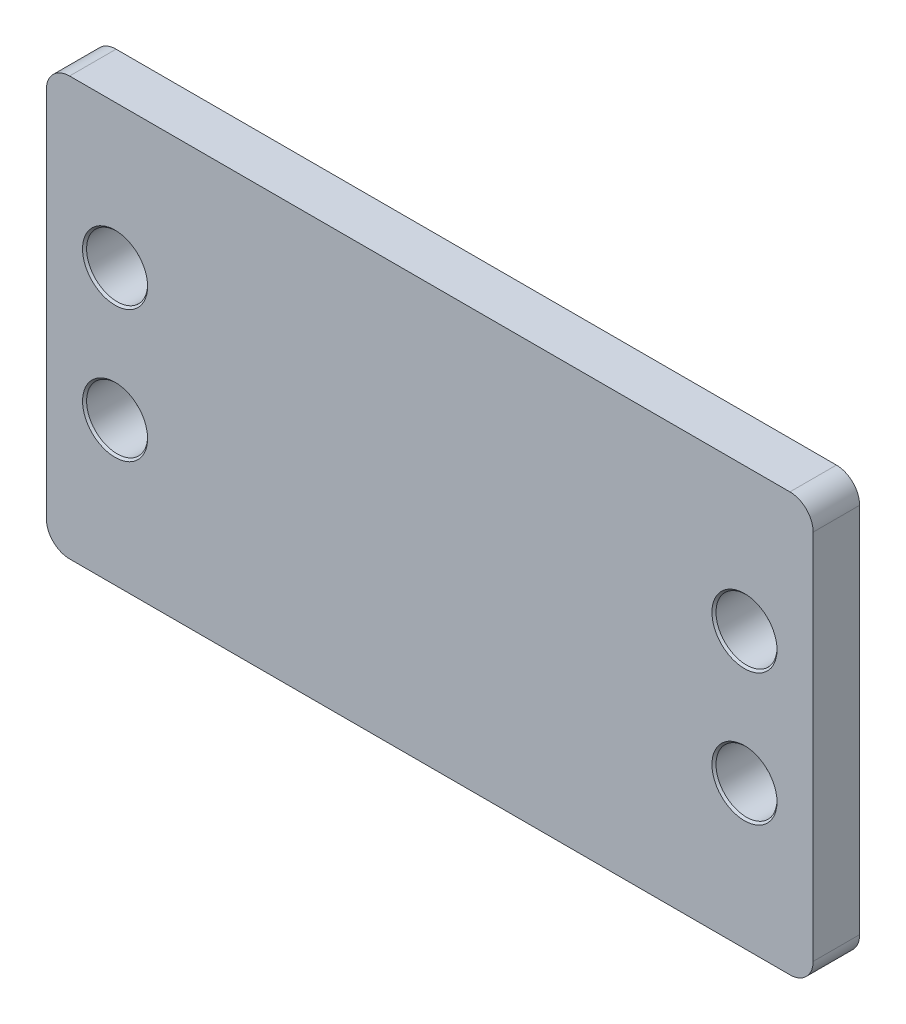
ISO-10303-21;
HEADER;
FILE_DESCRIPTION(('STEP AP214'),'2;1');
FILE_NAME('part.step','',(''),(''),'','','');
FILE_SCHEMA(('AUTOMOTIVE_DESIGN { 1 0 10303 214 1 1 1 1 }'));
ENDSEC;
DATA;
#1=APPLICATION_CONTEXT('core data for automotive mechanical design processes');
#2=APPLICATION_PROTOCOL_DEFINITION('international standard','automotive_design',2000,#1);
#3=PRODUCT_CONTEXT('',#1,'mechanical');
#4=PRODUCT('Part','Part','',(#3));
#5=PRODUCT_RELATED_PRODUCT_CATEGORY('part','',(#4));
#6=PRODUCT_DEFINITION_FORMATION('','',#4);
#7=PRODUCT_DEFINITION_CONTEXT('part definition',#1,'design');
#8=PRODUCT_DEFINITION('design','',#6,#7);
#9=PRODUCT_DEFINITION_SHAPE('','',#8);
#10=(LENGTH_UNIT() NAMED_UNIT(*) SI_UNIT(.MILLI.,.METRE.));
#11=(NAMED_UNIT(*) PLANE_ANGLE_UNIT() SI_UNIT($,.RADIAN.));
#12=(NAMED_UNIT(*) SI_UNIT($,.STERADIAN.) SOLID_ANGLE_UNIT());
#13=UNCERTAINTY_MEASURE_WITH_UNIT(LENGTH_MEASURE(1.E-05),#10,'distance_accuracy_value','');
#14=(GEOMETRIC_REPRESENTATION_CONTEXT(3) GLOBAL_UNCERTAINTY_ASSIGNED_CONTEXT((#13)) GLOBAL_UNIT_ASSIGNED_CONTEXT((#10,
#11,#12)) REPRESENTATION_CONTEXT('',''));
#15=CARTESIAN_POINT('',(0.,0.,0.));
#16=DIRECTION('',(0.,0.,1.));
#17=DIRECTION('',(1.,0.,0.));
#18=AXIS2_PLACEMENT_3D('',#15,#16,#17);
#19=CARTESIAN_POINT('',(-52.3875,28.575,-6.35));
#20=DIRECTION('',(-1.,0.,0.));
#21=DIRECTION('',(0.,0.,1.));
#22=AXIS2_PLACEMENT_3D('',#19,#20,#21);
#23=PLANE('',#22);
#24=DIRECTION('',(0.,-1.,0.));
#25=VECTOR('',#24,1.);
#26=CARTESIAN_POINT('',(-52.3875,28.575,0.));
#27=LINE('',#26,#25);
#28=CARTESIAN_POINT('',(-52.3875,25.4,0.));
#29=VERTEX_POINT('',#28);
#30=CARTESIAN_POINT('',(-52.3875,-25.4,0.));
#31=VERTEX_POINT('',#30);
#32=EDGE_CURVE('E163',#29,#31,#27,.T.);
#33=ORIENTED_EDGE('',*,*,#32,.F.);
#34=DIRECTION('',(0.,0.,1.));
#35=VECTOR('',#34,1.);
#36=CARTESIAN_POINT('',(-52.3875,25.4,-6.35));
#37=LINE('',#36,#35);
#38=CARTESIAN_POINT('',(-52.3875,25.4,-6.35));
#39=VERTEX_POINT('',#38);
#40=EDGE_CURVE('E12',#29,#39,#37,.F.);
#41=ORIENTED_EDGE('',*,*,#40,.T.);
#42=DIRECTION('',(0.,-1.,0.));
#43=VECTOR('',#42,1.);
#44=CARTESIAN_POINT('',(-52.3875,28.575,-6.35));
#45=LINE('',#44,#43);
#46=CARTESIAN_POINT('',(-52.3875,-25.4,-6.35));
#47=VERTEX_POINT('',#46);
#48=EDGE_CURVE('E166',#39,#47,#45,.T.);
#49=ORIENTED_EDGE('',*,*,#48,.T.);
#50=DIRECTION('',(0.,0.,1.));
#51=VECTOR('',#50,1.);
#52=CARTESIAN_POINT('',(-52.3875,-25.4,-6.35));
#53=LINE('',#52,#51);
#54=EDGE_CURVE('E47',#47,#31,#53,.T.);
#55=ORIENTED_EDGE('',*,*,#54,.T.);
#56=EDGE_LOOP('',(#33,#41,#49,#55));
#57=FACE_BOUND('',#56,.T.);
#58=ADVANCED_FACE('F39',(#57),#23,.T.);
#59=CARTESIAN_POINT('',(-52.3875,28.575,-6.35));
#60=DIRECTION('',(0.,1.,0.));
#61=DIRECTION('',(0.,0.,1.));
#62=AXIS2_PLACEMENT_3D('',#59,#60,#61);
#63=PLANE('',#62);
#64=DIRECTION('',(-1.,0.,0.));
#65=VECTOR('',#64,1.);
#66=CARTESIAN_POINT('',(-52.3875,28.575,0.));
#67=LINE('',#66,#65);
#68=CARTESIAN_POINT('',(49.2125,28.575,0.));
#69=VERTEX_POINT('',#68);
#70=CARTESIAN_POINT('',(-49.2125,28.575,0.));
#71=VERTEX_POINT('',#70);
#72=EDGE_CURVE('E124',#69,#71,#67,.T.);
#73=ORIENTED_EDGE('',*,*,#72,.F.);
#74=DIRECTION('',(0.,0.,1.));
#75=VECTOR('',#74,1.);
#76=CARTESIAN_POINT('',(49.2125,28.575,-6.35));
#77=LINE('',#76,#75);
#78=CARTESIAN_POINT('',(49.2125,28.575,-6.35));
#79=VERTEX_POINT('',#78);
#80=EDGE_CURVE('E142',#69,#79,#77,.F.);
#81=ORIENTED_EDGE('',*,*,#80,.T.);
#82=DIRECTION('',(-1.,0.,0.));
#83=VECTOR('',#82,1.);
#84=CARTESIAN_POINT('',(-52.3875,28.575,-6.35));
#85=LINE('',#84,#83);
#86=CARTESIAN_POINT('',(-49.2125,28.575,-6.35));
#87=VERTEX_POINT('',#86);
#88=EDGE_CURVE('E127',#79,#87,#85,.T.);
#89=ORIENTED_EDGE('',*,*,#88,.T.);
#90=DIRECTION('',(0.,0.,1.));
#91=VECTOR('',#90,1.);
#92=CARTESIAN_POINT('',(-49.2125,28.575,-6.35));
#93=LINE('',#92,#91);
#94=EDGE_CURVE('E139',#87,#71,#93,.T.);
#95=ORIENTED_EDGE('',*,*,#94,.T.);
#96=EDGE_LOOP('',(#73,#81,#89,#95));
#97=FACE_BOUND('',#96,.T.);
#98=ADVANCED_FACE('F234',(#97),#63,.T.);
#99=CARTESIAN_POINT('',(52.3875,28.575,-6.35));
#100=DIRECTION('',(1.,0.,0.));
#101=DIRECTION('',(0.,0.,-1.));
#102=AXIS2_PLACEMENT_3D('',#99,#100,#101);
#103=PLANE('',#102);
#104=DIRECTION('',(0.,1.,0.));
#105=VECTOR('',#104,1.);
#106=CARTESIAN_POINT('',(52.3875,28.575,-6.35));
#107=LINE('',#106,#105);
#108=CARTESIAN_POINT('',(52.3875,-25.4,-6.35));
#109=VERTEX_POINT('',#108);
#110=CARTESIAN_POINT('',(52.3875,25.4,-6.35));
#111=VERTEX_POINT('',#110);
#112=EDGE_CURVE('E132',#109,#111,#107,.T.);
#113=ORIENTED_EDGE('',*,*,#112,.T.);
#114=DIRECTION('',(0.,0.,1.));
#115=VECTOR('',#114,1.);
#116=CARTESIAN_POINT('',(52.3875,25.4,-6.35));
#117=LINE('',#116,#115);
#118=CARTESIAN_POINT('',(52.3875,25.4,0.));
#119=VERTEX_POINT('',#118);
#120=EDGE_CURVE('E123',#111,#119,#117,.T.);
#121=ORIENTED_EDGE('',*,*,#120,.T.);
#122=DIRECTION('',(0.,1.,0.));
#123=VECTOR('',#122,1.);
#124=CARTESIAN_POINT('',(52.3875,28.575,0.));
#125=LINE('',#124,#123);
#126=CARTESIAN_POINT('',(52.3875,-25.4,0.));
#127=VERTEX_POINT('',#126);
#128=EDGE_CURVE('E108',#127,#119,#125,.T.);
#129=ORIENTED_EDGE('',*,*,#128,.F.);
#130=DIRECTION('',(0.,0.,1.));
#131=VECTOR('',#130,1.);
#132=CARTESIAN_POINT('',(52.3875,-25.4,-6.35));
#133=LINE('',#132,#131);
#134=EDGE_CURVE('E121',#127,#109,#133,.F.);
#135=ORIENTED_EDGE('',*,*,#134,.T.);
#136=EDGE_LOOP('',(#113,#121,#129,#135));
#137=FACE_BOUND('',#136,.T.);
#138=ADVANCED_FACE('F120',(#137),#103,.T.);
#139=CARTESIAN_POINT('',(-52.3875,-28.575,-6.35));
#140=DIRECTION('',(0.,-1.,0.));
#141=DIRECTION('',(0.,0.,-1.));
#142=AXIS2_PLACEMENT_3D('',#139,#140,#141);
#143=PLANE('',#142);
#144=DIRECTION('',(1.,0.,0.));
#145=VECTOR('',#144,1.);
#146=CARTESIAN_POINT('',(-52.3875,-28.575,-6.35));
#147=LINE('',#146,#145);
#148=CARTESIAN_POINT('',(-49.2125,-28.575,-6.35));
#149=VERTEX_POINT('',#148);
#150=CARTESIAN_POINT('',(49.2125,-28.575,-6.35));
#151=VERTEX_POINT('',#150);
#152=EDGE_CURVE('E179',#149,#151,#147,.T.);
#153=ORIENTED_EDGE('',*,*,#152,.T.);
#154=DIRECTION('',(0.,0.,1.));
#155=VECTOR('',#154,1.);
#156=CARTESIAN_POINT('',(49.2125,-28.575,-6.35));
#157=LINE('',#156,#155);
#158=CARTESIAN_POINT('',(49.2125,-28.575,0.));
#159=VERTEX_POINT('',#158);
#160=EDGE_CURVE('E156',#151,#159,#157,.T.);
#161=ORIENTED_EDGE('',*,*,#160,.T.);
#162=DIRECTION('',(1.,0.,0.));
#163=VECTOR('',#162,1.);
#164=CARTESIAN_POINT('',(-52.3875,-28.575,0.));
#165=LINE('',#164,#163);
#166=CARTESIAN_POINT('',(-49.2125,-28.575,0.));
#167=VERTEX_POINT('',#166);
#168=EDGE_CURVE('E109',#167,#159,#165,.T.);
#169=ORIENTED_EDGE('',*,*,#168,.F.);
#170=DIRECTION('',(0.,0.,1.));
#171=VECTOR('',#170,1.);
#172=CARTESIAN_POINT('',(-49.2125,-28.575,-6.35));
#173=LINE('',#172,#171);
#174=EDGE_CURVE('E61',#167,#149,#173,.F.);
#175=ORIENTED_EDGE('',*,*,#174,.T.);
#176=EDGE_LOOP('',(#153,#161,#169,#175));
#177=FACE_BOUND('',#176,.T.);
#178=ADVANCED_FACE('F256',(#177),#143,.T.);
#179=CARTESIAN_POINT('',(-52.3875,-28.575,-6.35));
#180=DIRECTION('',(0.,0.,1.));
#181=DIRECTION('',(1.,0.,0.));
#182=AXIS2_PLACEMENT_3D('',#179,#180,#181);
#183=PLANE('',#182);
#184=CARTESIAN_POINT('',(-43.000000106,9.,-6.35));
#185=DIRECTION('',(0.,0.,1.));
#186=DIRECTION('',(1.,0.,0.));
#187=AXIS2_PLACEMENT_3D('',#184,#185,#186);
#188=CIRCLE('',#187,4.445);
#189=CARTESIAN_POINT('',(-38.555000106,9.,-6.35));
#190=VERTEX_POINT('',#189);
#191=EDGE_CURVE('E463',#190,#190,#188,.T.);
#192=ORIENTED_EDGE('',*,*,#191,.T.);
#193=EDGE_LOOP('',(#192));
#194=FACE_BOUND('',#193,.T.);
#195=CARTESIAN_POINT('',(-43.000000106,-9.,-6.35));
#196=DIRECTION('',(0.,0.,1.));
#197=DIRECTION('',(1.,0.,0.));
#198=AXIS2_PLACEMENT_3D('',#195,#196,#197);
#199=CIRCLE('',#198,4.445);
#200=CARTESIAN_POINT('',(-38.555000106,-9.,-6.35));
#201=VERTEX_POINT('',#200);
#202=EDGE_CURVE('E189',#201,#201,#199,.T.);
#203=ORIENTED_EDGE('',*,*,#202,.T.);
#204=EDGE_LOOP('',(#203));
#205=FACE_BOUND('',#204,.T.);
#206=CARTESIAN_POINT('',(43.000000106,9.,-6.35));
#207=DIRECTION('',(0.,0.,1.));
#208=DIRECTION('',(1.,0.,0.));
#209=AXIS2_PLACEMENT_3D('',#206,#207,#208);
#210=CIRCLE('',#209,4.445);
#211=CARTESIAN_POINT('',(47.445000106,9.,-6.35));
#212=VERTEX_POINT('',#211);
#213=EDGE_CURVE('E206',#212,#212,#210,.T.);
#214=ORIENTED_EDGE('',*,*,#213,.T.);
#215=EDGE_LOOP('',(#214));
#216=FACE_BOUND('',#215,.T.);
#217=CARTESIAN_POINT('',(43.000000106,-9.,-6.35));
#218=DIRECTION('',(0.,0.,1.));
#219=DIRECTION('',(1.,0.,0.));
#220=AXIS2_PLACEMENT_3D('',#217,#218,#219);
#221=CIRCLE('',#220,4.445);
#222=CARTESIAN_POINT('',(47.445000106,-9.,-6.35));
#223=VERTEX_POINT('',#222);
#224=EDGE_CURVE('E214',#223,#223,#221,.T.);
#225=ORIENTED_EDGE('',*,*,#224,.T.);
#226=EDGE_LOOP('',(#225));
#227=FACE_BOUND('',#226,.T.);
#228=ORIENTED_EDGE('',*,*,#88,.F.);
#229=CARTESIAN_POINT('',(49.2125,25.4,-6.35));
#230=DIRECTION('',(0.,0.,1.));
#231=DIRECTION('',(1.,0.,0.));
#232=AXIS2_PLACEMENT_3D('',#229,#230,#231);
#233=CIRCLE('',#232,3.175);
#234=EDGE_CURVE('E152',#79,#111,#233,.F.);
#235=ORIENTED_EDGE('',*,*,#234,.T.);
#236=ORIENTED_EDGE('',*,*,#112,.F.);
#237=CARTESIAN_POINT('',(49.2125,-25.4,-6.35));
#238=DIRECTION('',(0.,0.,1.));
#239=DIRECTION('',(1.,0.,0.));
#240=AXIS2_PLACEMENT_3D('',#237,#238,#239);
#241=CIRCLE('',#240,3.175);
#242=EDGE_CURVE('E54',#109,#151,#241,.F.);
#243=ORIENTED_EDGE('',*,*,#242,.T.);
#244=ORIENTED_EDGE('',*,*,#152,.F.);
#245=CARTESIAN_POINT('',(-49.2125,-25.4,-6.35));
#246=DIRECTION('',(0.,0.,1.));
#247=DIRECTION('',(1.,0.,0.));
#248=AXIS2_PLACEMENT_3D('',#245,#246,#247);
#249=CIRCLE('',#248,3.175);
#250=EDGE_CURVE('E144',#149,#47,#249,.F.);
#251=ORIENTED_EDGE('',*,*,#250,.T.);
#252=ORIENTED_EDGE('',*,*,#48,.F.);
#253=CARTESIAN_POINT('',(-49.2125,25.4,-6.35));
#254=DIRECTION('',(0.,0.,1.));
#255=DIRECTION('',(1.,0.,0.));
#256=AXIS2_PLACEMENT_3D('',#253,#254,#255);
#257=CIRCLE('',#256,3.175);
#258=EDGE_CURVE('E147',#39,#87,#257,.F.);
#259=ORIENTED_EDGE('',*,*,#258,.T.);
#260=EDGE_LOOP('',(#228,#235,#236,#243,#244,#251,#252,#259));
#261=FACE_BOUND('',#260,.T.);
#262=ADVANCED_FACE('F240',(#194,#205,#216,#227,#261),#183,.F.);
#263=CARTESIAN_POINT('',(-52.3875,-28.575,0.));
#264=DIRECTION('',(0.,0.,1.));
#265=DIRECTION('',(1.,0.,0.));
#266=AXIS2_PLACEMENT_3D('',#263,#264,#265);
#267=PLANE('',#266);
#268=CARTESIAN_POINT('',(-43.000000106,9.,0.));
#269=DIRECTION('',(0.,0.,1.));
#270=DIRECTION('',(1.,0.,0.));
#271=AXIS2_PLACEMENT_3D('',#268,#269,#270);
#272=CIRCLE('',#271,4.445);
#273=CARTESIAN_POINT('',(-38.555000106,9.,0.));
#274=VERTEX_POINT('',#273);
#275=EDGE_CURVE('E467',#274,#274,#272,.T.);
#276=ORIENTED_EDGE('',*,*,#275,.F.);
#277=EDGE_LOOP('',(#276));
#278=FACE_BOUND('',#277,.T.);
#279=CARTESIAN_POINT('',(-43.000000106,-9.,0.));
#280=DIRECTION('',(0.,0.,1.));
#281=DIRECTION('',(1.,0.,0.));
#282=AXIS2_PLACEMENT_3D('',#279,#280,#281);
#283=CIRCLE('',#282,4.445);
#284=CARTESIAN_POINT('',(-38.555000106,-9.,0.));
#285=VERTEX_POINT('',#284);
#286=EDGE_CURVE('E195',#285,#285,#283,.T.);
#287=ORIENTED_EDGE('',*,*,#286,.F.);
#288=EDGE_LOOP('',(#287));
#289=FACE_BOUND('',#288,.T.);
#290=CARTESIAN_POINT('',(43.000000106,9.,0.));
#291=DIRECTION('',(0.,0.,1.));
#292=DIRECTION('',(1.,0.,0.));
#293=AXIS2_PLACEMENT_3D('',#290,#291,#292);
#294=CIRCLE('',#293,4.445);
#295=CARTESIAN_POINT('',(47.445000106,9.,0.));
#296=VERTEX_POINT('',#295);
#297=EDGE_CURVE('E211',#296,#296,#294,.T.);
#298=ORIENTED_EDGE('',*,*,#297,.F.);
#299=EDGE_LOOP('',(#298));
#300=FACE_BOUND('',#299,.T.);
#301=CARTESIAN_POINT('',(43.000000106,-9.,0.));
#302=DIRECTION('',(0.,0.,1.));
#303=DIRECTION('',(1.,0.,0.));
#304=AXIS2_PLACEMENT_3D('',#301,#302,#303);
#305=CIRCLE('',#304,4.445);
#306=CARTESIAN_POINT('',(47.445000106,-9.,0.));
#307=VERTEX_POINT('',#306);
#308=EDGE_CURVE('E220',#307,#307,#305,.T.);
#309=ORIENTED_EDGE('',*,*,#308,.F.);
#310=EDGE_LOOP('',(#309));
#311=FACE_BOUND('',#310,.T.);
#312=ORIENTED_EDGE('',*,*,#128,.T.);
#313=CARTESIAN_POINT('',(49.2125,25.4,0.));
#314=DIRECTION('',(0.,0.,1.));
#315=DIRECTION('',(1.,0.,0.));
#316=AXIS2_PLACEMENT_3D('',#313,#314,#315);
#317=CIRCLE('',#316,3.175);
#318=EDGE_CURVE('E114',#119,#69,#317,.T.);
#319=ORIENTED_EDGE('',*,*,#318,.T.);
#320=ORIENTED_EDGE('',*,*,#72,.T.);
#321=CARTESIAN_POINT('',(-49.2125,25.4,0.));
#322=DIRECTION('',(0.,0.,1.));
#323=DIRECTION('',(1.,0.,0.));
#324=AXIS2_PLACEMENT_3D('',#321,#322,#323);
#325=CIRCLE('',#324,3.175);
#326=EDGE_CURVE('E115',#71,#29,#325,.T.);
#327=ORIENTED_EDGE('',*,*,#326,.T.);
#328=ORIENTED_EDGE('',*,*,#32,.T.);
#329=CARTESIAN_POINT('',(-49.2125,-25.4,0.));
#330=DIRECTION('',(0.,0.,1.));
#331=DIRECTION('',(1.,0.,0.));
#332=AXIS2_PLACEMENT_3D('',#329,#330,#331);
#333=CIRCLE('',#332,3.175);
#334=EDGE_CURVE('E129',#31,#167,#333,.T.);
#335=ORIENTED_EDGE('',*,*,#334,.T.);
#336=ORIENTED_EDGE('',*,*,#168,.T.);
#337=CARTESIAN_POINT('',(49.2125,-25.4,0.));
#338=DIRECTION('',(0.,0.,1.));
#339=DIRECTION('',(1.,0.,0.));
#340=AXIS2_PLACEMENT_3D('',#337,#338,#339);
#341=CIRCLE('',#340,3.175);
#342=EDGE_CURVE('E105',#159,#127,#341,.T.);
#343=ORIENTED_EDGE('',*,*,#342,.T.);
#344=EDGE_LOOP('',(#312,#319,#320,#327,#328,#335,#336,#343));
#345=FACE_BOUND('',#344,.T.);
#346=ADVANCED_FACE('F107',(#278,#289,#300,#311,#345),#267,.T.);
#347=CARTESIAN_POINT('',(43.000000106,-9.,-6.072251));
#348=DIRECTION('',(0.,0.,-1.));
#349=DIRECTION('',(-1.,0.,0.));
#350=AXIS2_PLACEMENT_3D('',#347,#348,#349);
#351=CONICAL_SURFACE('',#350,4.167251,0.785398163397447);
#352=ORIENTED_EDGE('',*,*,#224,.F.);
#353=EDGE_LOOP('',(#352));
#354=FACE_BOUND('',#353,.T.);
#355=CARTESIAN_POINT('',(43.000000106,-9.,-6.072251));
#356=DIRECTION('',(0.,0.,1.));
#357=DIRECTION('',(1.,0.,0.));
#358=AXIS2_PLACEMENT_3D('',#355,#356,#357);
#359=CIRCLE('',#358,4.167251);
#360=CARTESIAN_POINT('',(47.167251106,-9.,-6.072251));
#361=VERTEX_POINT('',#360);
#362=EDGE_CURVE('E170',#361,#361,#359,.T.);
#363=ORIENTED_EDGE('',*,*,#362,.T.);
#364=EDGE_LOOP('',(#363));
#365=FACE_BOUND('',#364,.T.);
#366=ADVANCED_FACE('F381',(#354,#365),#351,.F.);
#367=CARTESIAN_POINT('',(43.000000106,-9.,0.));
#368=DIRECTION('',(0.,0.,1.));
#369=DIRECTION('',(1.,0.,0.));
#370=AXIS2_PLACEMENT_3D('',#367,#368,#369);
#371=CYLINDRICAL_SURFACE('',#370,4.167251);
#372=ORIENTED_EDGE('',*,*,#362,.F.);
#373=EDGE_LOOP('',(#372));
#374=FACE_BOUND('',#373,.T.);
#375=CARTESIAN_POINT('',(43.000000106,-9.,-0.277748999999999));
#376=DIRECTION('',(0.,0.,1.));
#377=DIRECTION('',(1.,0.,0.));
#378=AXIS2_PLACEMENT_3D('',#375,#376,#377);
#379=CIRCLE('',#378,4.167251);
#380=CARTESIAN_POINT('',(47.167251106,-9.,-0.277748999999999));
#381=VERTEX_POINT('',#380);
#382=EDGE_CURVE('E174',#381,#381,#379,.T.);
#383=ORIENTED_EDGE('',*,*,#382,.T.);
#384=EDGE_LOOP('',(#383));
#385=FACE_BOUND('',#384,.T.);
#386=ADVANCED_FACE('F372',(#374,#385),#371,.F.);
#387=CARTESIAN_POINT('',(43.000000106,-9.,0.));
#388=DIRECTION('',(0.,0.,1.));
#389=DIRECTION('',(1.,0.,0.));
#390=AXIS2_PLACEMENT_3D('',#387,#388,#389);
#391=CONICAL_SURFACE('',#390,4.445,0.785398163397451);
#392=ORIENTED_EDGE('',*,*,#382,.F.);
#393=EDGE_LOOP('',(#392));
#394=FACE_BOUND('',#393,.T.);
#395=ORIENTED_EDGE('',*,*,#308,.T.);
#396=EDGE_LOOP('',(#395));
#397=FACE_BOUND('',#396,.T.);
#398=ADVANCED_FACE('F363',(#394,#397),#391,.F.);
#399=CARTESIAN_POINT('',(43.000000106,9.,-6.072251));
#400=DIRECTION('',(0.,0.,-1.));
#401=DIRECTION('',(-1.,0.,0.));
#402=AXIS2_PLACEMENT_3D('',#399,#400,#401);
#403=CONICAL_SURFACE('',#402,4.167251,0.785398163397447);
#404=ORIENTED_EDGE('',*,*,#213,.F.);
#405=EDGE_LOOP('',(#404));
#406=FACE_BOUND('',#405,.T.);
#407=CARTESIAN_POINT('',(43.000000106,9.,-6.072251));
#408=DIRECTION('',(0.,0.,1.));
#409=DIRECTION('',(1.,0.,0.));
#410=AXIS2_PLACEMENT_3D('',#407,#408,#409);
#411=CIRCLE('',#410,4.167251);
#412=CARTESIAN_POINT('',(47.167251106,9.,-6.072251));
#413=VERTEX_POINT('',#412);
#414=EDGE_CURVE('E221',#413,#413,#411,.T.);
#415=ORIENTED_EDGE('',*,*,#414,.T.);
#416=EDGE_LOOP('',(#415));
#417=FACE_BOUND('',#416,.T.);
#418=ADVANCED_FACE('F354',(#406,#417),#403,.F.);
#419=CARTESIAN_POINT('',(43.000000106,9.,0.));
#420=DIRECTION('',(0.,0.,1.));
#421=DIRECTION('',(1.,0.,0.));
#422=AXIS2_PLACEMENT_3D('',#419,#420,#421);
#423=CYLINDRICAL_SURFACE('',#422,4.167251);
#424=ORIENTED_EDGE('',*,*,#414,.F.);
#425=EDGE_LOOP('',(#424));
#426=FACE_BOUND('',#425,.T.);
#427=CARTESIAN_POINT('',(43.000000106,9.,-0.277748999999999));
#428=DIRECTION('',(0.,0.,1.));
#429=DIRECTION('',(1.,0.,0.));
#430=AXIS2_PLACEMENT_3D('',#427,#428,#429);
#431=CIRCLE('',#430,4.167251);
#432=CARTESIAN_POINT('',(47.167251106,9.,-0.277748999999999));
#433=VERTEX_POINT('',#432);
#434=EDGE_CURVE('E501',#433,#433,#431,.T.);
#435=ORIENTED_EDGE('',*,*,#434,.T.);
#436=EDGE_LOOP('',(#435));
#437=FACE_BOUND('',#436,.T.);
#438=ADVANCED_FACE('F345',(#426,#437),#423,.F.);
#439=CARTESIAN_POINT('',(43.000000106,9.,0.));
#440=DIRECTION('',(0.,0.,1.));
#441=DIRECTION('',(1.,0.,0.));
#442=AXIS2_PLACEMENT_3D('',#439,#440,#441);
#443=CONICAL_SURFACE('',#442,4.445,0.785398163397451);
#444=ORIENTED_EDGE('',*,*,#434,.F.);
#445=EDGE_LOOP('',(#444));
#446=FACE_BOUND('',#445,.T.);
#447=ORIENTED_EDGE('',*,*,#297,.T.);
#448=EDGE_LOOP('',(#447));
#449=FACE_BOUND('',#448,.T.);
#450=ADVANCED_FACE('F336',(#446,#449),#443,.F.);
#451=CARTESIAN_POINT('',(-43.000000106,-9.,-6.072251));
#452=DIRECTION('',(0.,0.,-1.));
#453=DIRECTION('',(-1.,0.,0.));
#454=AXIS2_PLACEMENT_3D('',#451,#452,#453);
#455=CONICAL_SURFACE('',#454,4.167251,0.785398163397447);
#456=ORIENTED_EDGE('',*,*,#202,.F.);
#457=EDGE_LOOP('',(#456));
#458=FACE_BOUND('',#457,.T.);
#459=CARTESIAN_POINT('',(-43.000000106,-9.,-6.072251));
#460=DIRECTION('',(0.,0.,1.));
#461=DIRECTION('',(1.,0.,0.));
#462=AXIS2_PLACEMENT_3D('',#459,#460,#461);
#463=CIRCLE('',#462,4.167251);
#464=CARTESIAN_POINT('',(-38.832749106,-9.,-6.072251));
#465=VERTEX_POINT('',#464);
#466=EDGE_CURVE('E203',#465,#465,#463,.T.);
#467=ORIENTED_EDGE('',*,*,#466,.T.);
#468=EDGE_LOOP('',(#467));
#469=FACE_BOUND('',#468,.T.);
#470=ADVANCED_FACE('F327',(#458,#469),#455,.F.);
#471=CARTESIAN_POINT('',(-43.000000106,-9.,0.));
#472=DIRECTION('',(0.,0.,1.));
#473=DIRECTION('',(1.,0.,0.));
#474=AXIS2_PLACEMENT_3D('',#471,#472,#473);
#475=CYLINDRICAL_SURFACE('',#474,4.167251);
#476=ORIENTED_EDGE('',*,*,#466,.F.);
#477=EDGE_LOOP('',(#476));
#478=FACE_BOUND('',#477,.T.);
#479=CARTESIAN_POINT('',(-43.000000106,-9.,-0.277748999999999));
#480=DIRECTION('',(0.,0.,1.));
#481=DIRECTION('',(1.,0.,0.));
#482=AXIS2_PLACEMENT_3D('',#479,#480,#481);
#483=CIRCLE('',#482,4.167251);
#484=CARTESIAN_POINT('',(-38.832749106,-9.,-0.277748999999999));
#485=VERTEX_POINT('',#484);
#486=EDGE_CURVE('E200',#485,#485,#483,.T.);
#487=ORIENTED_EDGE('',*,*,#486,.T.);
#488=EDGE_LOOP('',(#487));
#489=FACE_BOUND('',#488,.T.);
#490=ADVANCED_FACE('F318',(#478,#489),#475,.F.);
#491=CARTESIAN_POINT('',(-43.000000106,-9.,0.));
#492=DIRECTION('',(0.,0.,1.));
#493=DIRECTION('',(1.,0.,0.));
#494=AXIS2_PLACEMENT_3D('',#491,#492,#493);
#495=CONICAL_SURFACE('',#494,4.445,0.785398163397451);
#496=ORIENTED_EDGE('',*,*,#486,.F.);
#497=EDGE_LOOP('',(#496));
#498=FACE_BOUND('',#497,.T.);
#499=ORIENTED_EDGE('',*,*,#286,.T.);
#500=EDGE_LOOP('',(#499));
#501=FACE_BOUND('',#500,.T.);
#502=ADVANCED_FACE('F309',(#498,#501),#495,.F.);
#503=CARTESIAN_POINT('',(-43.000000106,9.,-6.072251));
#504=DIRECTION('',(0.,0.,-1.));
#505=DIRECTION('',(-1.,0.,0.));
#506=AXIS2_PLACEMENT_3D('',#503,#504,#505);
#507=CONICAL_SURFACE('',#506,4.167251,0.785398163397447);
#508=ORIENTED_EDGE('',*,*,#191,.F.);
#509=EDGE_LOOP('',(#508));
#510=FACE_BOUND('',#509,.T.);
#511=CARTESIAN_POINT('',(-43.000000106,9.,-6.072251));
#512=DIRECTION('',(0.,0.,1.));
#513=DIRECTION('',(1.,0.,0.));
#514=AXIS2_PLACEMENT_3D('',#511,#512,#513);
#515=CIRCLE('',#514,4.167251);
#516=CARTESIAN_POINT('',(-38.832749106,9.,-6.072251));
#517=VERTEX_POINT('',#516);
#518=EDGE_CURVE('E196',#517,#517,#515,.T.);
#519=ORIENTED_EDGE('',*,*,#518,.T.);
#520=EDGE_LOOP('',(#519));
#521=FACE_BOUND('',#520,.T.);
#522=ADVANCED_FACE('F300',(#510,#521),#507,.F.);
#523=CARTESIAN_POINT('',(-43.000000106,9.,0.));
#524=DIRECTION('',(0.,0.,1.));
#525=DIRECTION('',(1.,0.,0.));
#526=AXIS2_PLACEMENT_3D('',#523,#524,#525);
#527=CYLINDRICAL_SURFACE('',#526,4.167251);
#528=ORIENTED_EDGE('',*,*,#518,.F.);
#529=EDGE_LOOP('',(#528));
#530=FACE_BOUND('',#529,.T.);
#531=CARTESIAN_POINT('',(-43.000000106,9.,-0.277748999999999));
#532=DIRECTION('',(0.,0.,1.));
#533=DIRECTION('',(1.,0.,0.));
#534=AXIS2_PLACEMENT_3D('',#531,#532,#533);
#535=CIRCLE('',#534,4.167251);
#536=CARTESIAN_POINT('',(-38.832749106,9.,-0.277748999999999));
#537=VERTEX_POINT('',#536);
#538=EDGE_CURVE('E481',#537,#537,#535,.T.);
#539=ORIENTED_EDGE('',*,*,#538,.T.);
#540=EDGE_LOOP('',(#539));
#541=FACE_BOUND('',#540,.T.);
#542=ADVANCED_FACE('F291',(#530,#541),#527,.F.);
#543=CARTESIAN_POINT('',(-43.000000106,9.,0.));
#544=DIRECTION('',(0.,0.,1.));
#545=DIRECTION('',(1.,0.,0.));
#546=AXIS2_PLACEMENT_3D('',#543,#544,#545);
#547=CONICAL_SURFACE('',#546,4.445,0.785398163397451);
#548=ORIENTED_EDGE('',*,*,#538,.F.);
#549=EDGE_LOOP('',(#548));
#550=FACE_BOUND('',#549,.T.);
#551=ORIENTED_EDGE('',*,*,#275,.T.);
#552=EDGE_LOOP('',(#551));
#553=FACE_BOUND('',#552,.T.);
#554=ADVANCED_FACE('F260',(#550,#553),#547,.F.);
#555=CARTESIAN_POINT('',(49.2125,25.4,-6.35));
#556=DIRECTION('',(0.,0.,1.));
#557=DIRECTION('',(1.,0.,0.));
#558=AXIS2_PLACEMENT_3D('',#555,#556,#557);
#559=CYLINDRICAL_SURFACE('',#558,3.175);
#560=ORIENTED_EDGE('',*,*,#234,.F.);
#561=ORIENTED_EDGE('',*,*,#80,.F.);
#562=ORIENTED_EDGE('',*,*,#318,.F.);
#563=ORIENTED_EDGE('',*,*,#120,.F.);
#564=EDGE_LOOP('',(#560,#561,#562,#563));
#565=FACE_BOUND('',#564,.T.);
#566=ADVANCED_FACE('F239',(#565),#559,.T.);
#567=CARTESIAN_POINT('',(49.2125,-25.4,-6.35));
#568=DIRECTION('',(0.,0.,1.));
#569=DIRECTION('',(1.,0.,0.));
#570=AXIS2_PLACEMENT_3D('',#567,#568,#569);
#571=CYLINDRICAL_SURFACE('',#570,3.175);
#572=ORIENTED_EDGE('',*,*,#242,.F.);
#573=ORIENTED_EDGE('',*,*,#134,.F.);
#574=ORIENTED_EDGE('',*,*,#342,.F.);
#575=ORIENTED_EDGE('',*,*,#160,.F.);
#576=EDGE_LOOP('',(#572,#573,#574,#575));
#577=FACE_BOUND('',#576,.T.);
#578=ADVANCED_FACE('F126',(#577),#571,.T.);
#579=CARTESIAN_POINT('',(-49.2125,25.4,-6.35));
#580=DIRECTION('',(0.,0.,1.));
#581=DIRECTION('',(1.,0.,0.));
#582=AXIS2_PLACEMENT_3D('',#579,#580,#581);
#583=CYLINDRICAL_SURFACE('',#582,3.175);
#584=ORIENTED_EDGE('',*,*,#258,.F.);
#585=ORIENTED_EDGE('',*,*,#40,.F.);
#586=ORIENTED_EDGE('',*,*,#326,.F.);
#587=ORIENTED_EDGE('',*,*,#94,.F.);
#588=EDGE_LOOP('',(#584,#585,#586,#587));
#589=FACE_BOUND('',#588,.T.);
#590=ADVANCED_FACE('F243',(#589),#583,.T.);
#591=CARTESIAN_POINT('',(-49.2125,-25.4,-6.35));
#592=DIRECTION('',(0.,0.,1.));
#593=DIRECTION('',(1.,0.,0.));
#594=AXIS2_PLACEMENT_3D('',#591,#592,#593);
#595=CYLINDRICAL_SURFACE('',#594,3.175);
#596=ORIENTED_EDGE('',*,*,#250,.F.);
#597=ORIENTED_EDGE('',*,*,#174,.F.);
#598=ORIENTED_EDGE('',*,*,#334,.F.);
#599=ORIENTED_EDGE('',*,*,#54,.F.);
#600=EDGE_LOOP('',(#596,#597,#598,#599));
#601=FACE_BOUND('',#600,.T.);
#602=ADVANCED_FACE('F41',(#601),#595,.T.);
#603=CLOSED_SHELL('',(#58,#98,#138,#178,#262,#346,#366,#386,#398,#418,#438,#450,#470,#490,#502,
#522,#542,#554,#566,#578,#590,#602));
#604=MANIFOLD_SOLID_BREP('B2',#603);
#605=ADVANCED_BREP_SHAPE_REPRESENTATION('',(#18,#604),#14);
#606=SHAPE_DEFINITION_REPRESENTATION(#9,#605);
ENDSEC;
END-ISO-10303-21;
